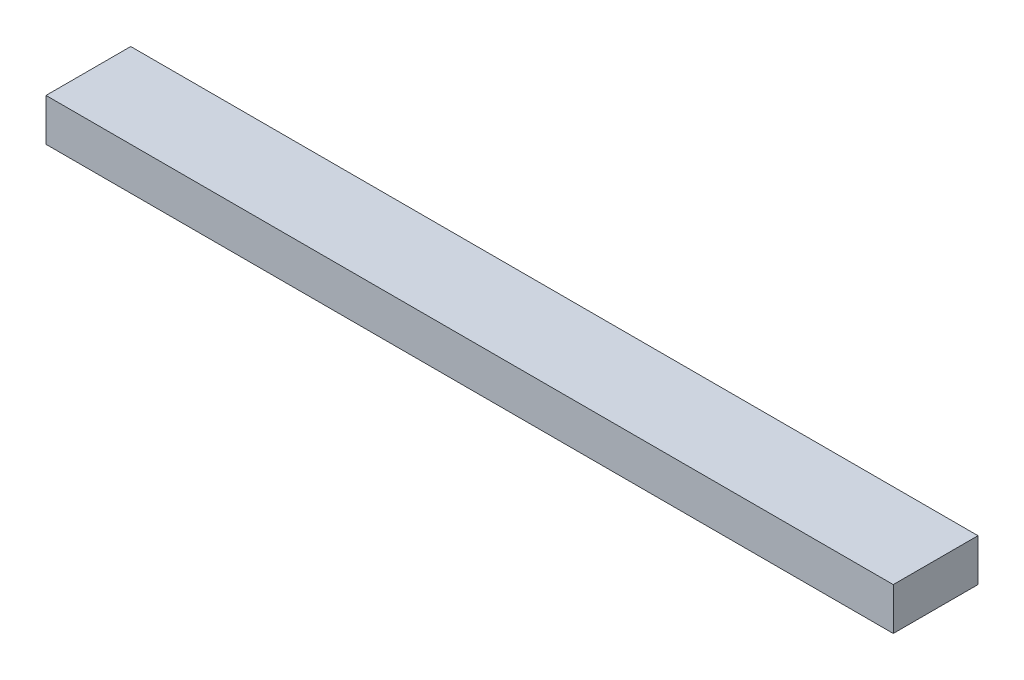
ISO-10303-21;
HEADER;
FILE_DESCRIPTION(('STEP AP214'),'2;1');
FILE_NAME('part.step','',(''),(''),'','','');
FILE_SCHEMA(('AUTOMOTIVE_DESIGN { 1 0 10303 214 1 1 1 1 }'));
ENDSEC;
DATA;
#1=APPLICATION_CONTEXT('core data for automotive mechanical design processes');
#2=APPLICATION_PROTOCOL_DEFINITION('international standard','automotive_design',2000,#1);
#3=PRODUCT_CONTEXT('',#1,'mechanical');
#4=PRODUCT('Part','Part','',(#3));
#5=PRODUCT_RELATED_PRODUCT_CATEGORY('part','',(#4));
#6=PRODUCT_DEFINITION_FORMATION('','',#4);
#7=PRODUCT_DEFINITION_CONTEXT('part definition',#1,'design');
#8=PRODUCT_DEFINITION('design','',#6,#7);
#9=PRODUCT_DEFINITION_SHAPE('','',#8);
#10=(LENGTH_UNIT() NAMED_UNIT(*) SI_UNIT(.MILLI.,.METRE.));
#11=(NAMED_UNIT(*) PLANE_ANGLE_UNIT() SI_UNIT($,.RADIAN.));
#12=(NAMED_UNIT(*) SI_UNIT($,.STERADIAN.) SOLID_ANGLE_UNIT());
#13=UNCERTAINTY_MEASURE_WITH_UNIT(LENGTH_MEASURE(1.E-05),#10,'distance_accuracy_value','');
#14=(GEOMETRIC_REPRESENTATION_CONTEXT(3) GLOBAL_UNCERTAINTY_ASSIGNED_CONTEXT((#13)) GLOBAL_UNIT_ASSIGNED_CONTEXT((#10,
#11,#12)) REPRESENTATION_CONTEXT('',''));
#15=CARTESIAN_POINT('',(0.,0.,0.));
#16=DIRECTION('',(0.,0.,1.));
#17=DIRECTION('',(1.,0.,0.));
#18=AXIS2_PLACEMENT_3D('',#15,#16,#17);
#19=CARTESIAN_POINT('',(0.,12.7,0.));
#20=DIRECTION('',(1.,0.,0.));
#21=DIRECTION('',(0.,0.,-1.));
#22=AXIS2_PLACEMENT_3D('',#19,#20,#21);
#23=PLANE('',#22);
#24=DIRECTION('',(0.,0.,1.));
#25=VECTOR('',#24,1.);
#26=CARTESIAN_POINT('',(0.,0.,0.));
#27=LINE('',#26,#25);
#28=CARTESIAN_POINT('',(0.,0.,-25.4));
#29=VERTEX_POINT('',#28);
#30=CARTESIAN_POINT('',(0.,0.,0.));
#31=VERTEX_POINT('',#30);
#32=EDGE_CURVE('E96',#29,#31,#27,.T.);
#33=ORIENTED_EDGE('',*,*,#32,.T.);
#34=DIRECTION('',(0.,-1.,0.));
#35=VECTOR('',#34,1.);
#36=CARTESIAN_POINT('',(0.,12.7,0.));
#37=LINE('',#36,#35);
#38=CARTESIAN_POINT('',(0.,12.7,0.));
#39=VERTEX_POINT('',#38);
#40=EDGE_CURVE('E11',#39,#31,#37,.T.);
#41=ORIENTED_EDGE('',*,*,#40,.F.);
#42=DIRECTION('',(0.,0.,1.));
#43=VECTOR('',#42,1.);
#44=CARTESIAN_POINT('',(0.,12.7,0.));
#45=LINE('',#44,#43);
#46=CARTESIAN_POINT('',(0.,12.7,-25.4));
#47=VERTEX_POINT('',#46);
#48=EDGE_CURVE('E84',#47,#39,#45,.T.);
#49=ORIENTED_EDGE('',*,*,#48,.F.);
#50=DIRECTION('',(0.,-1.,0.));
#51=VECTOR('',#50,1.);
#52=CARTESIAN_POINT('',(0.,12.7,-25.4));
#53=LINE('',#52,#51);
#54=EDGE_CURVE('E92',#47,#29,#53,.T.);
#55=ORIENTED_EDGE('',*,*,#54,.T.);
#56=EDGE_LOOP('',(#33,#41,#49,#55));
#57=FACE_BOUND('',#56,.T.);
#58=ADVANCED_FACE('F33',(#57),#23,.F.);
#59=CARTESIAN_POINT('',(0.,12.7,0.));
#60=DIRECTION('',(0.,0.,-1.));
#61=DIRECTION('',(-1.,0.,0.));
#62=AXIS2_PLACEMENT_3D('',#59,#60,#61);
#63=PLANE('',#62);
#64=DIRECTION('',(1.,0.,0.));
#65=VECTOR('',#64,1.);
#66=CARTESIAN_POINT('',(0.,0.,0.));
#67=LINE('',#66,#65);
#68=CARTESIAN_POINT('',(254.,0.,0.));
#69=VERTEX_POINT('',#68);
#70=EDGE_CURVE('E88',#31,#69,#67,.T.);
#71=ORIENTED_EDGE('',*,*,#70,.T.);
#72=DIRECTION('',(0.,-1.,0.));
#73=VECTOR('',#72,1.);
#74=CARTESIAN_POINT('',(254.,12.7,0.));
#75=LINE('',#74,#73);
#76=CARTESIAN_POINT('',(254.,12.7,0.));
#77=VERTEX_POINT('',#76);
#78=EDGE_CURVE('E41',#77,#69,#75,.T.);
#79=ORIENTED_EDGE('',*,*,#78,.F.);
#80=DIRECTION('',(1.,0.,0.));
#81=VECTOR('',#80,1.);
#82=CARTESIAN_POINT('',(0.,12.7,0.));
#83=LINE('',#82,#81);
#84=EDGE_CURVE('E79',#39,#77,#83,.T.);
#85=ORIENTED_EDGE('',*,*,#84,.F.);
#86=ORIENTED_EDGE('',*,*,#40,.T.);
#87=EDGE_LOOP('',(#71,#79,#85,#86));
#88=FACE_BOUND('',#87,.T.);
#89=ADVANCED_FACE('F87',(#88),#63,.F.);
#90=CARTESIAN_POINT('',(254.,12.7,0.));
#91=DIRECTION('',(-1.,0.,0.));
#92=DIRECTION('',(0.,0.,1.));
#93=AXIS2_PLACEMENT_3D('',#90,#91,#92);
#94=PLANE('',#93);
#95=DIRECTION('',(0.,0.,-1.));
#96=VECTOR('',#95,1.);
#97=CARTESIAN_POINT('',(254.,0.,0.));
#98=LINE('',#97,#96);
#99=CARTESIAN_POINT('',(254.,0.,-25.4));
#100=VERTEX_POINT('',#99);
#101=EDGE_CURVE('E66',#69,#100,#98,.T.);
#102=ORIENTED_EDGE('',*,*,#101,.T.);
#103=DIRECTION('',(0.,-1.,0.));
#104=VECTOR('',#103,1.);
#105=CARTESIAN_POINT('',(254.,12.7,-25.4));
#106=LINE('',#105,#104);
#107=CARTESIAN_POINT('',(254.,12.7,-25.4));
#108=VERTEX_POINT('',#107);
#109=EDGE_CURVE('E89',#108,#100,#106,.T.);
#110=ORIENTED_EDGE('',*,*,#109,.F.);
#111=DIRECTION('',(0.,0.,-1.));
#112=VECTOR('',#111,1.);
#113=CARTESIAN_POINT('',(254.,12.7,0.));
#114=LINE('',#113,#112);
#115=EDGE_CURVE('E82',#77,#108,#114,.T.);
#116=ORIENTED_EDGE('',*,*,#115,.F.);
#117=ORIENTED_EDGE('',*,*,#78,.T.);
#118=EDGE_LOOP('',(#102,#110,#116,#117));
#119=FACE_BOUND('',#118,.T.);
#120=ADVANCED_FACE('F90',(#119),#94,.F.);
#121=CARTESIAN_POINT('',(0.,12.7,-25.4));
#122=DIRECTION('',(0.,0.,1.));
#123=DIRECTION('',(1.,0.,0.));
#124=AXIS2_PLACEMENT_3D('',#121,#122,#123);
#125=PLANE('',#124);
#126=DIRECTION('',(-1.,0.,0.));
#127=VECTOR('',#126,1.);
#128=CARTESIAN_POINT('',(0.,0.,-25.4));
#129=LINE('',#128,#127);
#130=EDGE_CURVE('E72',#100,#29,#129,.T.);
#131=ORIENTED_EDGE('',*,*,#130,.T.);
#132=ORIENTED_EDGE('',*,*,#54,.F.);
#133=DIRECTION('',(-1.,0.,0.));
#134=VECTOR('',#133,1.);
#135=CARTESIAN_POINT('',(0.,12.7,-25.4));
#136=LINE('',#135,#134);
#137=EDGE_CURVE('E49',#108,#47,#136,.T.);
#138=ORIENTED_EDGE('',*,*,#137,.F.);
#139=ORIENTED_EDGE('',*,*,#109,.T.);
#140=EDGE_LOOP('',(#131,#132,#138,#139));
#141=FACE_BOUND('',#140,.T.);
#142=ADVANCED_FACE('F103',(#141),#125,.F.);
#143=CARTESIAN_POINT('',(0.,12.7,0.));
#144=DIRECTION('',(0.,-1.,0.));
#145=DIRECTION('',(0.,0.,-1.));
#146=AXIS2_PLACEMENT_3D('',#143,#144,#145);
#147=PLANE('',#146);
#148=ORIENTED_EDGE('',*,*,#48,.T.);
#149=ORIENTED_EDGE('',*,*,#84,.T.);
#150=ORIENTED_EDGE('',*,*,#115,.T.);
#151=ORIENTED_EDGE('',*,*,#137,.T.);
#152=EDGE_LOOP('',(#148,#149,#150,#151));
#153=FACE_BOUND('',#152,.T.);
#154=ADVANCED_FACE('F80',(#153),#147,.F.);
#155=CARTESIAN_POINT('',(0.,0.,0.));
#156=DIRECTION('',(0.,-1.,0.));
#157=DIRECTION('',(0.,0.,-1.));
#158=AXIS2_PLACEMENT_3D('',#155,#156,#157);
#159=PLANE('',#158);
#160=ORIENTED_EDGE('',*,*,#32,.F.);
#161=ORIENTED_EDGE('',*,*,#130,.F.);
#162=ORIENTED_EDGE('',*,*,#101,.F.);
#163=ORIENTED_EDGE('',*,*,#70,.F.);
#164=EDGE_LOOP('',(#160,#161,#162,#163));
#165=FACE_BOUND('',#164,.T.);
#166=ADVANCED_FACE('F106',(#165),#159,.T.);
#167=CLOSED_SHELL('',(#58,#89,#120,#142,#154,#166));
#168=MANIFOLD_SOLID_BREP('B2',#167);
#169=ADVANCED_BREP_SHAPE_REPRESENTATION('',(#18,#168),#14);
#170=SHAPE_DEFINITION_REPRESENTATION(#9,#169);
ENDSEC;
END-ISO-10303-21;
